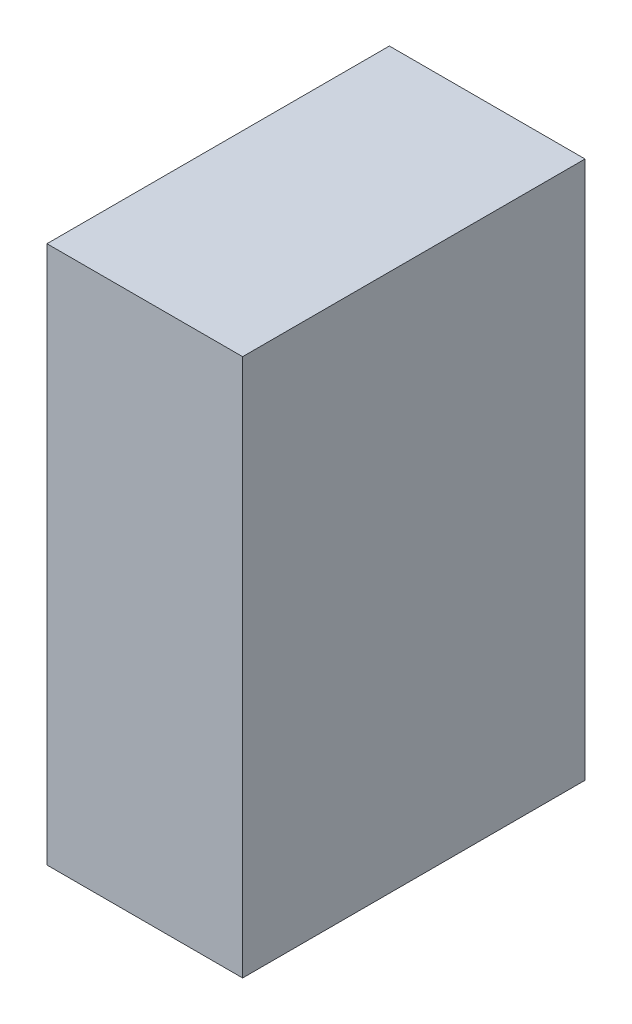
ISO-10303-21;
HEADER;
FILE_DESCRIPTION(('STEP AP214'),'2;1');
FILE_NAME('part.step','',(''),(''),'','','');
FILE_SCHEMA(('AUTOMOTIVE_DESIGN { 1 0 10303 214 1 1 1 1 }'));
ENDSEC;
DATA;
#1=APPLICATION_CONTEXT('core data for automotive mechanical design processes');
#2=APPLICATION_PROTOCOL_DEFINITION('international standard','automotive_design',2000,#1);
#3=PRODUCT_CONTEXT('',#1,'mechanical');
#4=PRODUCT('Part','Part','',(#3));
#5=PRODUCT_RELATED_PRODUCT_CATEGORY('part','',(#4));
#6=PRODUCT_DEFINITION_FORMATION('','',#4);
#7=PRODUCT_DEFINITION_CONTEXT('part definition',#1,'design');
#8=PRODUCT_DEFINITION('design','',#6,#7);
#9=PRODUCT_DEFINITION_SHAPE('','',#8);
#10=(LENGTH_UNIT() NAMED_UNIT(*) SI_UNIT(.MILLI.,.METRE.));
#11=(NAMED_UNIT(*) PLANE_ANGLE_UNIT() SI_UNIT($,.RADIAN.));
#12=(NAMED_UNIT(*) SI_UNIT($,.STERADIAN.) SOLID_ANGLE_UNIT());
#13=UNCERTAINTY_MEASURE_WITH_UNIT(LENGTH_MEASURE(1.E-05),#10,'distance_accuracy_value','');
#14=(GEOMETRIC_REPRESENTATION_CONTEXT(3) GLOBAL_UNCERTAINTY_ASSIGNED_CONTEXT((#13)) GLOBAL_UNIT_ASSIGNED_CONTEXT((#10,
#11,#12)) REPRESENTATION_CONTEXT('',''));
#15=CARTESIAN_POINT('',(0.,0.,0.));
#16=DIRECTION('',(0.,0.,1.));
#17=DIRECTION('',(1.,0.,0.));
#18=AXIS2_PLACEMENT_3D('',#15,#16,#17);
#19=CARTESIAN_POINT('',(0.,0.,177.8));
#20=DIRECTION('',(-1.,0.,0.));
#21=DIRECTION('',(0.,0.,1.));
#22=AXIS2_PLACEMENT_3D('',#19,#20,#21);
#23=PLANE('',#22);
#24=DIRECTION('',(0.,1.,0.));
#25=VECTOR('',#24,1.);
#26=CARTESIAN_POINT('',(0.,0.,0.));
#27=LINE('',#26,#25);
#28=CARTESIAN_POINT('',(0.,0.,0.));
#29=VERTEX_POINT('',#28);
#30=CARTESIAN_POINT('',(0.,279.4,0.));
#31=VERTEX_POINT('',#30);
#32=EDGE_CURVE('E100',#29,#31,#27,.T.);
#33=ORIENTED_EDGE('',*,*,#32,.F.);
#34=DIRECTION('',(0.,0.,-1.));
#35=VECTOR('',#34,1.);
#36=CARTESIAN_POINT('',(0.,0.,177.8));
#37=LINE('',#36,#35);
#38=CARTESIAN_POINT('',(0.,0.,177.8));
#39=VERTEX_POINT('',#38);
#40=EDGE_CURVE('E11',#39,#29,#37,.T.);
#41=ORIENTED_EDGE('',*,*,#40,.F.);
#42=DIRECTION('',(0.,1.,0.));
#43=VECTOR('',#42,1.);
#44=CARTESIAN_POINT('',(0.,0.,177.8));
#45=LINE('',#44,#43);
#46=CARTESIAN_POINT('',(0.,279.4,177.8));
#47=VERTEX_POINT('',#46);
#48=EDGE_CURVE('E95',#39,#47,#45,.T.);
#49=ORIENTED_EDGE('',*,*,#48,.T.);
#50=DIRECTION('',(0.,0.,-1.));
#51=VECTOR('',#50,1.);
#52=CARTESIAN_POINT('',(0.,279.4,177.8));
#53=LINE('',#52,#51);
#54=EDGE_CURVE('E38',#47,#31,#53,.T.);
#55=ORIENTED_EDGE('',*,*,#54,.T.);
#56=EDGE_LOOP('',(#33,#41,#49,#55));
#57=FACE_BOUND('',#56,.T.);
#58=ADVANCED_FACE('F35',(#57),#23,.T.);
#59=CARTESIAN_POINT('',(0.,0.,177.8));
#60=DIRECTION('',(0.,1.,0.));
#61=DIRECTION('',(0.,0.,1.));
#62=AXIS2_PLACEMENT_3D('',#59,#60,#61);
#63=PLANE('',#62);
#64=DIRECTION('',(1.,0.,0.));
#65=VECTOR('',#64,1.);
#66=CARTESIAN_POINT('',(0.,0.,0.));
#67=LINE('',#66,#65);
#68=CARTESIAN_POINT('',(101.6,0.,0.));
#69=VERTEX_POINT('',#68);
#70=EDGE_CURVE('E68',#29,#69,#67,.T.);
#71=ORIENTED_EDGE('',*,*,#70,.T.);
#72=DIRECTION('',(0.,0.,-1.));
#73=VECTOR('',#72,1.);
#74=CARTESIAN_POINT('',(101.6,0.,177.8));
#75=LINE('',#74,#73);
#76=CARTESIAN_POINT('',(101.6,0.,177.8));
#77=VERTEX_POINT('',#76);
#78=EDGE_CURVE('E44',#77,#69,#75,.T.);
#79=ORIENTED_EDGE('',*,*,#78,.F.);
#80=DIRECTION('',(1.,0.,0.));
#81=VECTOR('',#80,1.);
#82=CARTESIAN_POINT('',(0.,0.,177.8));
#83=LINE('',#82,#81);
#84=EDGE_CURVE('E85',#39,#77,#83,.T.);
#85=ORIENTED_EDGE('',*,*,#84,.F.);
#86=ORIENTED_EDGE('',*,*,#40,.T.);
#87=EDGE_LOOP('',(#71,#79,#85,#86));
#88=FACE_BOUND('',#87,.T.);
#89=ADVANCED_FACE('F110',(#88),#63,.F.);
#90=CARTESIAN_POINT('',(101.6,0.,177.8));
#91=DIRECTION('',(-1.,0.,0.));
#92=DIRECTION('',(0.,0.,1.));
#93=AXIS2_PLACEMENT_3D('',#90,#91,#92);
#94=PLANE('',#93);
#95=DIRECTION('',(0.,1.,0.));
#96=VECTOR('',#95,1.);
#97=CARTESIAN_POINT('',(101.6,0.,0.));
#98=LINE('',#97,#96);
#99=CARTESIAN_POINT('',(101.6,279.4,0.));
#100=VERTEX_POINT('',#99);
#101=EDGE_CURVE('E92',#69,#100,#98,.T.);
#102=ORIENTED_EDGE('',*,*,#101,.T.);
#103=DIRECTION('',(0.,0.,-1.));
#104=VECTOR('',#103,1.);
#105=CARTESIAN_POINT('',(101.6,279.4,177.8));
#106=LINE('',#105,#104);
#107=CARTESIAN_POINT('',(101.6,279.4,177.8));
#108=VERTEX_POINT('',#107);
#109=EDGE_CURVE('E89',#108,#100,#106,.T.);
#110=ORIENTED_EDGE('',*,*,#109,.F.);
#111=DIRECTION('',(0.,1.,0.));
#112=VECTOR('',#111,1.);
#113=CARTESIAN_POINT('',(101.6,0.,177.8));
#114=LINE('',#113,#112);
#115=EDGE_CURVE('E80',#77,#108,#114,.T.);
#116=ORIENTED_EDGE('',*,*,#115,.F.);
#117=ORIENTED_EDGE('',*,*,#78,.T.);
#118=EDGE_LOOP('',(#102,#110,#116,#117));
#119=FACE_BOUND('',#118,.T.);
#120=ADVANCED_FACE('F90',(#119),#94,.F.);
#121=CARTESIAN_POINT('',(0.,279.4,177.8));
#122=DIRECTION('',(0.,1.,0.));
#123=DIRECTION('',(0.,0.,1.));
#124=AXIS2_PLACEMENT_3D('',#121,#122,#123);
#125=PLANE('',#124);
#126=DIRECTION('',(1.,0.,0.));
#127=VECTOR('',#126,1.);
#128=CARTESIAN_POINT('',(0.,279.4,0.));
#129=LINE('',#128,#127);
#130=EDGE_CURVE('E103',#31,#100,#129,.T.);
#131=ORIENTED_EDGE('',*,*,#130,.F.);
#132=ORIENTED_EDGE('',*,*,#54,.F.);
#133=DIRECTION('',(1.,0.,0.));
#134=VECTOR('',#133,1.);
#135=CARTESIAN_POINT('',(0.,279.4,177.8));
#136=LINE('',#135,#134);
#137=EDGE_CURVE('E84',#47,#108,#136,.T.);
#138=ORIENTED_EDGE('',*,*,#137,.T.);
#139=ORIENTED_EDGE('',*,*,#109,.T.);
#140=EDGE_LOOP('',(#131,#132,#138,#139));
#141=FACE_BOUND('',#140,.T.);
#142=ADVANCED_FACE('F94',(#141),#125,.T.);
#143=CARTESIAN_POINT('',(0.,0.,177.8));
#144=DIRECTION('',(0.,0.,-1.));
#145=DIRECTION('',(-1.,0.,0.));
#146=AXIS2_PLACEMENT_3D('',#143,#144,#145);
#147=PLANE('',#146);
#148=ORIENTED_EDGE('',*,*,#48,.F.);
#149=ORIENTED_EDGE('',*,*,#84,.T.);
#150=ORIENTED_EDGE('',*,*,#115,.T.);
#151=ORIENTED_EDGE('',*,*,#137,.F.);
#152=EDGE_LOOP('',(#148,#149,#150,#151));
#153=FACE_BOUND('',#152,.T.);
#154=ADVANCED_FACE('F83',(#153),#147,.F.);
#155=CARTESIAN_POINT('',(0.,0.,0.));
#156=DIRECTION('',(0.,0.,-1.));
#157=DIRECTION('',(-1.,0.,0.));
#158=AXIS2_PLACEMENT_3D('',#155,#156,#157);
#159=PLANE('',#158);
#160=ORIENTED_EDGE('',*,*,#32,.T.);
#161=ORIENTED_EDGE('',*,*,#130,.T.);
#162=ORIENTED_EDGE('',*,*,#101,.F.);
#163=ORIENTED_EDGE('',*,*,#70,.F.);
#164=EDGE_LOOP('',(#160,#161,#162,#163));
#165=FACE_BOUND('',#164,.T.);
#166=ADVANCED_FACE('F108',(#165),#159,.T.);
#167=CLOSED_SHELL('',(#58,#89,#120,#142,#154,#166));
#168=MANIFOLD_SOLID_BREP('B2',#167);
#169=ADVANCED_BREP_SHAPE_REPRESENTATION('',(#18,#168),#14);
#170=SHAPE_DEFINITION_REPRESENTATION(#9,#169);
ENDSEC;
END-ISO-10303-21;
